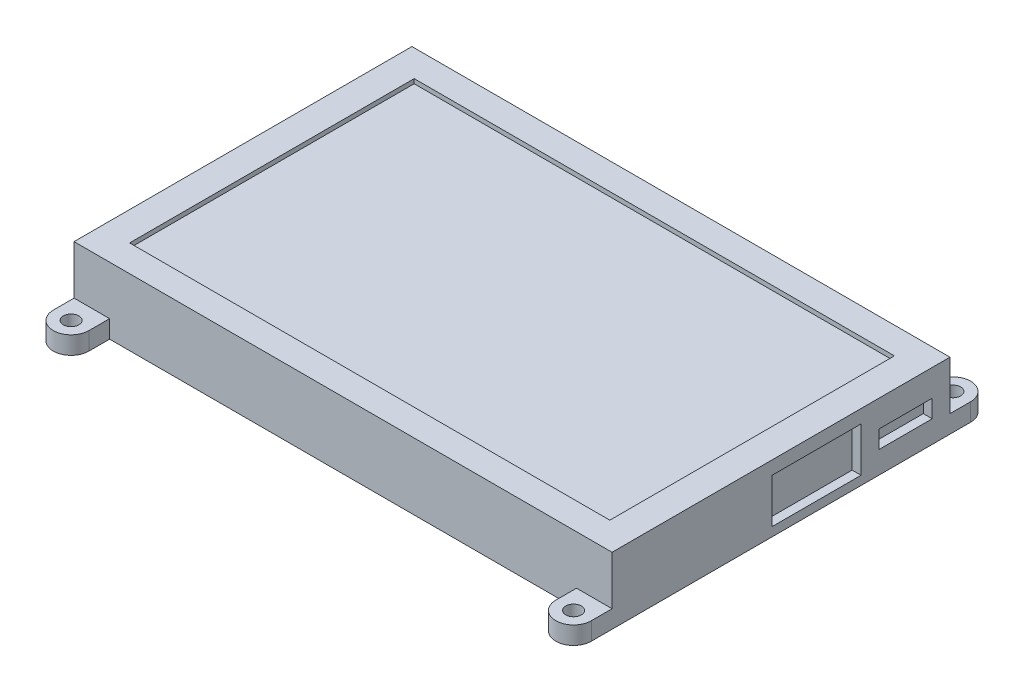
ISO-10303-21;
HEADER;
FILE_DESCRIPTION(('STEP AP214'),'2;1');
FILE_NAME('part.step','',(''),(''),'','','');
FILE_SCHEMA(('AUTOMOTIVE_DESIGN { 1 0 10303 214 1 1 1 1 }'));
ENDSEC;
DATA;
#1=APPLICATION_CONTEXT('core data for automotive mechanical design processes');
#2=APPLICATION_PROTOCOL_DEFINITION('international standard','automotive_design',2000,#1);
#3=PRODUCT_CONTEXT('',#1,'mechanical');
#4=PRODUCT('Part','Part','',(#3));
#5=PRODUCT_RELATED_PRODUCT_CATEGORY('part','',(#4));
#6=PRODUCT_DEFINITION_FORMATION('','',#4);
#7=PRODUCT_DEFINITION_CONTEXT('part definition',#1,'design');
#8=PRODUCT_DEFINITION('design','',#6,#7);
#9=PRODUCT_DEFINITION_SHAPE('','',#8);
#10=(LENGTH_UNIT() NAMED_UNIT(*) SI_UNIT(.MILLI.,.METRE.));
#11=(NAMED_UNIT(*) PLANE_ANGLE_UNIT() SI_UNIT($,.RADIAN.));
#12=(NAMED_UNIT(*) SI_UNIT($,.STERADIAN.) SOLID_ANGLE_UNIT());
#13=UNCERTAINTY_MEASURE_WITH_UNIT(LENGTH_MEASURE(1.E-05),#10,'distance_accuracy_value','');
#14=(GEOMETRIC_REPRESENTATION_CONTEXT(3) GLOBAL_UNCERTAINTY_ASSIGNED_CONTEXT((#13)) GLOBAL_UNIT_ASSIGNED_CONTEXT((#10,
#11,#12)) REPRESENTATION_CONTEXT('',''));
#15=CARTESIAN_POINT('',(0.,0.,0.));
#16=DIRECTION('',(0.,0.,1.));
#17=DIRECTION('',(1.,0.,0.));
#18=AXIS2_PLACEMENT_3D('',#15,#16,#17);
#19=CARTESIAN_POINT('',(0.,0.,0.));
#20=DIRECTION('',(0.,-1.,0.));
#21=DIRECTION('',(0.,0.,-1.));
#22=AXIS2_PLACEMENT_3D('',#19,#20,#21);
#23=PLANE('',#22);
#24=CARTESIAN_POINT('',(117.,0.,4.66000000000001));
#25=DIRECTION('',(0.,-1.,0.));
#26=DIRECTION('',(0.,0.,-1.));
#27=AXIS2_PLACEMENT_3D('',#24,#25,#26);
#28=CIRCLE('',#27,1.75);
#29=CARTESIAN_POINT('',(117.,0.,2.91000000000001));
#30=VERTEX_POINT('',#29);
#31=EDGE_CURVE('E286',#30,#30,#28,.T.);
#32=ORIENTED_EDGE('',*,*,#31,.F.);
#33=EDGE_LOOP('',(#32));
#34=FACE_BOUND('',#33,.T.);
#35=CARTESIAN_POINT('',(117.,0.,-80.65));
#36=DIRECTION('',(0.,-1.,0.));
#37=DIRECTION('',(0.,0.,1.));
#38=AXIS2_PLACEMENT_3D('',#35,#36,#37);
#39=CIRCLE('',#38,4.);
#40=CARTESIAN_POINT('',(113.,0.,-80.65));
#41=VERTEX_POINT('',#40);
#42=CARTESIAN_POINT('',(121.,0.,-80.65));
#43=VERTEX_POINT('',#42);
#44=EDGE_CURVE('E355',#41,#43,#39,.T.);
#45=ORIENTED_EDGE('',*,*,#44,.T.);
#46=DIRECTION('',(0.,0.,-1.));
#47=VECTOR('',#46,1.);
#48=CARTESIAN_POINT('',(121.,0.,0.));
#49=LINE('',#48,#47);
#50=CARTESIAN_POINT('',(121.,0.,4.66000000000001));
#51=VERTEX_POINT('',#50);
#52=EDGE_CURVE('E446',#51,#43,#49,.T.);
#53=ORIENTED_EDGE('',*,*,#52,.F.);
#54=CARTESIAN_POINT('',(117.,0.,4.66000000000001));
#55=DIRECTION('',(0.,-1.,0.));
#56=DIRECTION('',(0.,0.,-1.));
#57=AXIS2_PLACEMENT_3D('',#54,#55,#56);
#58=CIRCLE('',#57,4.);
#59=CARTESIAN_POINT('',(113.,0.,4.66000000000001));
#60=VERTEX_POINT('',#59);
#61=EDGE_CURVE('E307',#51,#60,#58,.T.);
#62=ORIENTED_EDGE('',*,*,#61,.T.);
#63=DIRECTION('',(0.,0.,-1.));
#64=VECTOR('',#63,1.);
#65=CARTESIAN_POINT('',(113.,0.,4.66000000000001));
#66=LINE('',#65,#64);
#67=CARTESIAN_POINT('',(113.,0.,0.));
#68=VERTEX_POINT('',#67);
#69=EDGE_CURVE('E314',#60,#68,#66,.T.);
#70=ORIENTED_EDGE('',*,*,#69,.T.);
#71=DIRECTION('',(1.,0.,0.));
#72=VECTOR('',#71,1.);
#73=CARTESIAN_POINT('',(0.,0.,0.));
#74=LINE('',#73,#72);
#75=CARTESIAN_POINT('',(8.,0.,0.));
#76=VERTEX_POINT('',#75);
#77=EDGE_CURVE('E434',#76,#68,#74,.T.);
#78=ORIENTED_EDGE('',*,*,#77,.F.);
#79=DIRECTION('',(0.,0.,1.));
#80=VECTOR('',#79,1.);
#81=CARTESIAN_POINT('',(8.,0.,4.66));
#82=LINE('',#81,#80);
#83=CARTESIAN_POINT('',(8.,0.,4.66));
#84=VERTEX_POINT('',#83);
#85=EDGE_CURVE('E338',#76,#84,#82,.T.);
#86=ORIENTED_EDGE('',*,*,#85,.T.);
#87=CARTESIAN_POINT('',(4.,0.,4.66));
#88=DIRECTION('',(0.,-1.,0.));
#89=DIRECTION('',(0.,0.,1.));
#90=AXIS2_PLACEMENT_3D('',#87,#88,#89);
#91=CIRCLE('',#90,4.);
#92=CARTESIAN_POINT('',(0.,0.,4.66));
#93=VERTEX_POINT('',#92);
#94=EDGE_CURVE('E333',#84,#93,#91,.T.);
#95=ORIENTED_EDGE('',*,*,#94,.T.);
#96=DIRECTION('',(0.,0.,-1.));
#97=VECTOR('',#96,1.);
#98=CARTESIAN_POINT('',(0.,0.,0.));
#99=LINE('',#98,#97);
#100=CARTESIAN_POINT('',(0.,0.,-80.65));
#101=VERTEX_POINT('',#100);
#102=EDGE_CURVE('E423',#93,#101,#99,.T.);
#103=ORIENTED_EDGE('',*,*,#102,.T.);
#104=CARTESIAN_POINT('',(4.,0.,-80.65));
#105=DIRECTION('',(0.,-1.,0.));
#106=DIRECTION('',(0.,0.,-1.));
#107=AXIS2_PLACEMENT_3D('',#104,#105,#106);
#108=CIRCLE('',#107,4.);
#109=CARTESIAN_POINT('',(8.,0.,-80.65));
#110=VERTEX_POINT('',#109);
#111=EDGE_CURVE('E376',#101,#110,#108,.T.);
#112=ORIENTED_EDGE('',*,*,#111,.T.);
#113=DIRECTION('',(0.,0.,1.));
#114=VECTOR('',#113,1.);
#115=CARTESIAN_POINT('',(8.,0.,-80.65));
#116=LINE('',#115,#114);
#117=CARTESIAN_POINT('',(8.,0.,-75.99));
#118=VERTEX_POINT('',#117);
#119=EDGE_CURVE('E381',#110,#118,#116,.T.);
#120=ORIENTED_EDGE('',*,*,#119,.T.);
#121=DIRECTION('',(1.,0.,0.));
#122=VECTOR('',#121,1.);
#123=CARTESIAN_POINT('',(0.,0.,-75.99));
#124=LINE('',#123,#122);
#125=CARTESIAN_POINT('',(113.,0.,-75.99));
#126=VERTEX_POINT('',#125);
#127=EDGE_CURVE('E443',#118,#126,#124,.T.);
#128=ORIENTED_EDGE('',*,*,#127,.T.);
#129=DIRECTION('',(0.,0.,-1.));
#130=VECTOR('',#129,1.);
#131=CARTESIAN_POINT('',(113.,0.,-80.65));
#132=LINE('',#131,#130);
#133=EDGE_CURVE('E360',#126,#41,#132,.T.);
#134=ORIENTED_EDGE('',*,*,#133,.T.);
#135=EDGE_LOOP('',(#45,#53,#62,#70,#78,#86,#95,#103,#112,#120,#128,#134));
#136=FACE_BOUND('',#135,.T.);
#137=CARTESIAN_POINT('',(117.,0.,-80.65));
#138=DIRECTION('',(0.,1.,0.));
#139=DIRECTION('',(0.,0.,1.));
#140=AXIS2_PLACEMENT_3D('',#137,#138,#139);
#141=CIRCLE('',#140,1.75);
#142=CARTESIAN_POINT('',(117.,0.,-78.9));
#143=VERTEX_POINT('',#142);
#144=EDGE_CURVE('E289',#143,#143,#141,.T.);
#145=ORIENTED_EDGE('',*,*,#144,.T.);
#146=EDGE_LOOP('',(#145));
#147=FACE_BOUND('',#146,.T.);
#148=CARTESIAN_POINT('',(4.,0.,-80.65));
#149=DIRECTION('',(0.,-1.,0.));
#150=DIRECTION('',(0.,0.,-1.));
#151=AXIS2_PLACEMENT_3D('',#148,#149,#150);
#152=CIRCLE('',#151,1.75);
#153=CARTESIAN_POINT('',(4.,0.,-82.4));
#154=VERTEX_POINT('',#153);
#155=EDGE_CURVE('E299',#154,#154,#152,.T.);
#156=ORIENTED_EDGE('',*,*,#155,.F.);
#157=EDGE_LOOP('',(#156));
#158=FACE_BOUND('',#157,.T.);
#159=CARTESIAN_POINT('',(4.,0.,4.66));
#160=DIRECTION('',(0.,1.,0.));
#161=DIRECTION('',(0.,0.,1.));
#162=AXIS2_PLACEMENT_3D('',#159,#160,#161);
#163=CIRCLE('',#162,1.75);
#164=CARTESIAN_POINT('',(4.,0.,6.41));
#165=VERTEX_POINT('',#164);
#166=EDGE_CURVE('E293',#165,#165,#163,.T.);
#167=ORIENTED_EDGE('',*,*,#166,.T.);
#168=EDGE_LOOP('',(#167));
#169=FACE_BOUND('',#168,.T.);
#170=ADVANCED_FACE('F33',(#34,#136,#147,#158,#169),#23,.T.);
#171=CARTESIAN_POINT('',(0.,15.,0.));
#172=DIRECTION('',(-1.,0.,0.));
#173=DIRECTION('',(0.,0.,1.));
#174=AXIS2_PLACEMENT_3D('',#171,#172,#173);
#175=PLANE('',#174);
#176=DIRECTION('',(0.,-1.,0.));
#177=VECTOR('',#176,1.);
#178=CARTESIAN_POINT('',(0.,4.,-80.65));
#179=LINE('',#178,#177);
#180=CARTESIAN_POINT('',(0.,4.,-80.65));
#181=VERTEX_POINT('',#180);
#182=EDGE_CURVE('E390',#181,#101,#179,.T.);
#183=ORIENTED_EDGE('',*,*,#182,.T.);
#184=ORIENTED_EDGE('',*,*,#102,.F.);
#185=DIRECTION('',(0.,-1.,0.));
#186=VECTOR('',#185,1.);
#187=CARTESIAN_POINT('',(0.,4.,4.66));
#188=LINE('',#187,#186);
#189=CARTESIAN_POINT('',(0.,4.,4.66));
#190=VERTEX_POINT('',#189);
#191=EDGE_CURVE('E343',#190,#93,#188,.T.);
#192=ORIENTED_EDGE('',*,*,#191,.F.);
#193=DIRECTION('',(0.,0.,-1.));
#194=VECTOR('',#193,1.);
#195=CARTESIAN_POINT('',(0.,4.,4.66));
#196=LINE('',#195,#194);
#197=CARTESIAN_POINT('',(0.,4.,0.));
#198=VERTEX_POINT('',#197);
#199=EDGE_CURVE('E337',#190,#198,#196,.T.);
#200=ORIENTED_EDGE('',*,*,#199,.T.);
#201=DIRECTION('',(0.,-1.,0.));
#202=VECTOR('',#201,1.);
#203=CARTESIAN_POINT('',(0.,15.,0.));
#204=LINE('',#203,#202);
#205=CARTESIAN_POINT('',(0.,15.,0.));
#206=VERTEX_POINT('',#205);
#207=EDGE_CURVE('E449',#206,#198,#204,.T.);
#208=ORIENTED_EDGE('',*,*,#207,.F.);
#209=DIRECTION('',(0.,0.,-1.));
#210=VECTOR('',#209,1.);
#211=CARTESIAN_POINT('',(0.,15.,0.));
#212=LINE('',#211,#210);
#213=CARTESIAN_POINT('',(0.,15.,-75.99));
#214=VERTEX_POINT('',#213);
#215=EDGE_CURVE('E430',#206,#214,#212,.T.);
#216=ORIENTED_EDGE('',*,*,#215,.T.);
#217=DIRECTION('',(0.,-1.,0.));
#218=VECTOR('',#217,1.);
#219=CARTESIAN_POINT('',(0.,15.,-75.99));
#220=LINE('',#219,#218);
#221=CARTESIAN_POINT('',(0.,4.,-75.99));
#222=VERTEX_POINT('',#221);
#223=EDGE_CURVE('E441',#214,#222,#220,.T.);
#224=ORIENTED_EDGE('',*,*,#223,.T.);
#225=DIRECTION('',(0.,0.,-1.));
#226=VECTOR('',#225,1.);
#227=CARTESIAN_POINT('',(0.,4.,-80.65));
#228=LINE('',#227,#226);
#229=EDGE_CURVE('E384',#222,#181,#228,.T.);
#230=ORIENTED_EDGE('',*,*,#229,.T.);
#231=EDGE_LOOP('',(#183,#184,#192,#200,#208,#216,#224,#230));
#232=FACE_BOUND('',#231,.T.);
#233=ADVANCED_FACE('F35',(#232),#175,.T.);
#234=CARTESIAN_POINT('',(0.,15.,0.));
#235=DIRECTION('',(0.,0.,-1.));
#236=DIRECTION('',(-1.,0.,0.));
#237=AXIS2_PLACEMENT_3D('',#234,#235,#236);
#238=PLANE('',#237);
#239=ORIENTED_EDGE('',*,*,#77,.T.);
#240=DIRECTION('',(0.,1.,0.));
#241=VECTOR('',#240,1.);
#242=CARTESIAN_POINT('',(113.,15.,0.));
#243=LINE('',#242,#241);
#244=CARTESIAN_POINT('',(113.,4.,0.));
#245=VERTEX_POINT('',#244);
#246=EDGE_CURVE('E327',#68,#245,#243,.T.);
#247=ORIENTED_EDGE('',*,*,#246,.T.);
#248=DIRECTION('',(-1.,0.,0.));
#249=VECTOR('',#248,1.);
#250=CARTESIAN_POINT('',(0.,4.,0.));
#251=LINE('',#250,#249);
#252=CARTESIAN_POINT('',(121.,4.,0.));
#253=VERTEX_POINT('',#252);
#254=EDGE_CURVE('E330',#253,#245,#251,.T.);
#255=ORIENTED_EDGE('',*,*,#254,.F.);
#256=DIRECTION('',(0.,-1.,0.));
#257=VECTOR('',#256,1.);
#258=CARTESIAN_POINT('',(121.,15.,0.));
#259=LINE('',#258,#257);
#260=CARTESIAN_POINT('',(121.,15.,0.));
#261=VERTEX_POINT('',#260);
#262=EDGE_CURVE('E452',#261,#253,#259,.T.);
#263=ORIENTED_EDGE('',*,*,#262,.F.);
#264=DIRECTION('',(1.,0.,0.));
#265=VECTOR('',#264,1.);
#266=CARTESIAN_POINT('',(0.,15.,0.));
#267=LINE('',#266,#265);
#268=EDGE_CURVE('E439',#206,#261,#267,.T.);
#269=ORIENTED_EDGE('',*,*,#268,.F.);
#270=ORIENTED_EDGE('',*,*,#207,.T.);
#271=DIRECTION('',(1.,0.,0.));
#272=VECTOR('',#271,1.);
#273=CARTESIAN_POINT('',(0.,4.,0.));
#274=LINE('',#273,#272);
#275=CARTESIAN_POINT('',(8.,4.,0.));
#276=VERTEX_POINT('',#275);
#277=EDGE_CURVE('E11',#198,#276,#274,.T.);
#278=ORIENTED_EDGE('',*,*,#277,.T.);
#279=DIRECTION('',(0.,-1.,0.));
#280=VECTOR('',#279,1.);
#281=CARTESIAN_POINT('',(8.,15.,0.));
#282=LINE('',#281,#280);
#283=EDGE_CURVE('E350',#276,#76,#282,.T.);
#284=ORIENTED_EDGE('',*,*,#283,.T.);
#285=EDGE_LOOP('',(#239,#247,#255,#263,#269,#270,#278,#284));
#286=FACE_BOUND('',#285,.T.);
#287=ADVANCED_FACE('F484',(#286),#238,.F.);
#288=CARTESIAN_POINT('',(121.,15.,0.));
#289=DIRECTION('',(-1.,0.,0.));
#290=DIRECTION('',(0.,0.,1.));
#291=AXIS2_PLACEMENT_3D('',#288,#289,#290);
#292=PLANE('',#291);
#293=DIRECTION('',(0.,0.,-1.));
#294=VECTOR('',#293,1.);
#295=CARTESIAN_POINT('',(121.,2.,-55.99));
#296=LINE('',#295,#294);
#297=CARTESIAN_POINT('',(121.,2.,-35.99));
#298=VERTEX_POINT('',#297);
#299=CARTESIAN_POINT('',(121.,2.,-55.99));
#300=VERTEX_POINT('',#299);
#301=EDGE_CURVE('E246',#298,#300,#296,.T.);
#302=ORIENTED_EDGE('',*,*,#301,.F.);
#303=DIRECTION('',(0.,-1.,0.));
#304=VECTOR('',#303,1.);
#305=CARTESIAN_POINT('',(121.,12.,-35.99));
#306=LINE('',#305,#304);
#307=CARTESIAN_POINT('',(121.,12.,-35.99));
#308=VERTEX_POINT('',#307);
#309=EDGE_CURVE('E48',#308,#298,#306,.T.);
#310=ORIENTED_EDGE('',*,*,#309,.F.);
#311=DIRECTION('',(0.,0.,1.));
#312=VECTOR('',#311,1.);
#313=CARTESIAN_POINT('',(121.,12.,-55.99));
#314=LINE('',#313,#312);
#315=CARTESIAN_POINT('',(121.,12.,-55.99));
#316=VERTEX_POINT('',#315);
#317=EDGE_CURVE('E237',#316,#308,#314,.T.);
#318=ORIENTED_EDGE('',*,*,#317,.F.);
#319=DIRECTION('',(0.,1.,0.));
#320=VECTOR('',#319,1.);
#321=CARTESIAN_POINT('',(121.,12.,-55.99));
#322=LINE('',#321,#320);
#323=EDGE_CURVE('E240',#300,#316,#322,.T.);
#324=ORIENTED_EDGE('',*,*,#323,.F.);
#325=EDGE_LOOP('',(#302,#310,#318,#324));
#326=FACE_BOUND('',#325,.T.);
#327=DIRECTION('',(0.,0.,-1.));
#328=VECTOR('',#327,1.);
#329=CARTESIAN_POINT('',(121.,5.,-71.99));
#330=LINE('',#329,#328);
#331=CARTESIAN_POINT('',(121.,5.,-59.99));
#332=VERTEX_POINT('',#331);
#333=CARTESIAN_POINT('',(121.,5.,-71.99));
#334=VERTEX_POINT('',#333);
#335=EDGE_CURVE('E270',#332,#334,#330,.T.);
#336=ORIENTED_EDGE('',*,*,#335,.F.);
#337=DIRECTION('',(0.,-1.,0.));
#338=VECTOR('',#337,1.);
#339=CARTESIAN_POINT('',(121.,9.,-59.99));
#340=LINE('',#339,#338);
#341=CARTESIAN_POINT('',(121.,9.,-59.99));
#342=VERTEX_POINT('',#341);
#343=EDGE_CURVE('E56',#342,#332,#340,.T.);
#344=ORIENTED_EDGE('',*,*,#343,.F.);
#345=DIRECTION('',(0.,0.,1.));
#346=VECTOR('',#345,1.);
#347=CARTESIAN_POINT('',(121.,9.,-71.99));
#348=LINE('',#347,#346);
#349=CARTESIAN_POINT('',(121.,9.,-71.99));
#350=VERTEX_POINT('',#349);
#351=EDGE_CURVE('E259',#350,#342,#348,.T.);
#352=ORIENTED_EDGE('',*,*,#351,.F.);
#353=DIRECTION('',(0.,1.,0.));
#354=VECTOR('',#353,1.);
#355=CARTESIAN_POINT('',(121.,9.,-71.99));
#356=LINE('',#355,#354);
#357=EDGE_CURVE('E273',#334,#350,#356,.T.);
#358=ORIENTED_EDGE('',*,*,#357,.F.);
#359=EDGE_LOOP('',(#336,#344,#352,#358));
#360=FACE_BOUND('',#359,.T.);
#361=ORIENTED_EDGE('',*,*,#52,.T.);
#362=DIRECTION('',(0.,-1.,0.));
#363=VECTOR('',#362,1.);
#364=CARTESIAN_POINT('',(121.,4.,-80.65));
#365=LINE('',#364,#363);
#366=CARTESIAN_POINT('',(121.,4.,-80.65));
#367=VERTEX_POINT('',#366);
#368=EDGE_CURVE('E365',#367,#43,#365,.T.);
#369=ORIENTED_EDGE('',*,*,#368,.F.);
#370=DIRECTION('',(0.,0.,1.));
#371=VECTOR('',#370,1.);
#372=CARTESIAN_POINT('',(121.,4.,-80.65));
#373=LINE('',#372,#371);
#374=CARTESIAN_POINT('',(121.,4.,-75.99));
#375=VERTEX_POINT('',#374);
#376=EDGE_CURVE('E359',#367,#375,#373,.T.);
#377=ORIENTED_EDGE('',*,*,#376,.T.);
#378=DIRECTION('',(0.,-1.,0.));
#379=VECTOR('',#378,1.);
#380=CARTESIAN_POINT('',(121.,15.,-75.99));
#381=LINE('',#380,#379);
#382=CARTESIAN_POINT('',(121.,15.,-75.99));
#383=VERTEX_POINT('',#382);
#384=EDGE_CURVE('E455',#383,#375,#381,.T.);
#385=ORIENTED_EDGE('',*,*,#384,.F.);
#386=DIRECTION('',(0.,0.,-1.));
#387=VECTOR('',#386,1.);
#388=CARTESIAN_POINT('',(121.,15.,0.));
#389=LINE('',#388,#387);
#390=EDGE_CURVE('E437',#261,#383,#389,.T.);
#391=ORIENTED_EDGE('',*,*,#390,.F.);
#392=ORIENTED_EDGE('',*,*,#262,.T.);
#393=DIRECTION('',(0.,0.,1.));
#394=VECTOR('',#393,1.);
#395=CARTESIAN_POINT('',(121.,4.,4.66000000000001));
#396=LINE('',#395,#394);
#397=CARTESIAN_POINT('',(121.,4.,4.66000000000001));
#398=VERTEX_POINT('',#397);
#399=EDGE_CURVE('E317',#253,#398,#396,.T.);
#400=ORIENTED_EDGE('',*,*,#399,.T.);
#401=DIRECTION('',(0.,-1.,0.));
#402=VECTOR('',#401,1.);
#403=CARTESIAN_POINT('',(121.,4.,4.66000000000001));
#404=LINE('',#403,#402);
#405=EDGE_CURVE('E324',#398,#51,#404,.T.);
#406=ORIENTED_EDGE('',*,*,#405,.T.);
#407=EDGE_LOOP('',(#361,#369,#377,#385,#391,#392,#400,#406));
#408=FACE_BOUND('',#407,.T.);
#409=ADVANCED_FACE('F471',(#326,#360,#408),#292,.F.);
#410=CARTESIAN_POINT('',(0.,15.,-75.99));
#411=DIRECTION('',(0.,0.,-1.));
#412=DIRECTION('',(-1.,0.,0.));
#413=AXIS2_PLACEMENT_3D('',#410,#411,#412);
#414=PLANE('',#413);
#415=DIRECTION('',(0.,1.,0.));
#416=VECTOR('',#415,1.);
#417=CARTESIAN_POINT('',(113.,15.,-75.99));
#418=LINE('',#417,#416);
#419=CARTESIAN_POINT('',(113.,4.,-75.99));
#420=VERTEX_POINT('',#419);
#421=EDGE_CURVE('E372',#126,#420,#418,.T.);
#422=ORIENTED_EDGE('',*,*,#421,.F.);
#423=ORIENTED_EDGE('',*,*,#127,.F.);
#424=DIRECTION('',(0.,-1.,0.));
#425=VECTOR('',#424,1.);
#426=CARTESIAN_POINT('',(8.,15.,-75.99));
#427=LINE('',#426,#425);
#428=CARTESIAN_POINT('',(8.,4.,-75.99));
#429=VERTEX_POINT('',#428);
#430=EDGE_CURVE('E393',#429,#118,#427,.T.);
#431=ORIENTED_EDGE('',*,*,#430,.F.);
#432=DIRECTION('',(-1.,0.,0.));
#433=VECTOR('',#432,1.);
#434=CARTESIAN_POINT('',(0.,4.,-75.99));
#435=LINE('',#434,#433);
#436=EDGE_CURVE('E451',#429,#222,#435,.T.);
#437=ORIENTED_EDGE('',*,*,#436,.T.);
#438=ORIENTED_EDGE('',*,*,#223,.F.);
#439=DIRECTION('',(1.,0.,0.));
#440=VECTOR('',#439,1.);
#441=CARTESIAN_POINT('',(0.,15.,-75.99));
#442=LINE('',#441,#440);
#443=EDGE_CURVE('E433',#214,#383,#442,.T.);
#444=ORIENTED_EDGE('',*,*,#443,.T.);
#445=ORIENTED_EDGE('',*,*,#384,.T.);
#446=DIRECTION('',(1.,0.,0.));
#447=VECTOR('',#446,1.);
#448=CARTESIAN_POINT('',(0.,4.,-75.99));
#449=LINE('',#448,#447);
#450=EDGE_CURVE('E41',#420,#375,#449,.T.);
#451=ORIENTED_EDGE('',*,*,#450,.F.);
#452=EDGE_LOOP('',(#422,#423,#431,#437,#438,#444,#445,#451));
#453=FACE_BOUND('',#452,.T.);
#454=ADVANCED_FACE('F473',(#453),#414,.T.);
#455=CARTESIAN_POINT('',(0.,15.,0.));
#456=DIRECTION('',(0.,-1.,0.));
#457=DIRECTION('',(0.,0.,-1.));
#458=AXIS2_PLACEMENT_3D('',#455,#456,#457);
#459=PLANE('',#458);
#460=DIRECTION('',(-1.,0.,0.));
#461=VECTOR('',#460,1.);
#462=CARTESIAN_POINT('',(6.49999999999998,15.,-69.995));
#463=LINE('',#462,#461);
#464=CARTESIAN_POINT('',(114.5,15.,-69.995));
#465=VERTEX_POINT('',#464);
#466=CARTESIAN_POINT('',(6.49999999999998,15.,-69.995));
#467=VERTEX_POINT('',#466);
#468=EDGE_CURVE('E413',#465,#467,#463,.T.);
#469=ORIENTED_EDGE('',*,*,#468,.F.);
#470=DIRECTION('',(0.,0.,-1.));
#471=VECTOR('',#470,1.);
#472=CARTESIAN_POINT('',(114.5,15.,-69.995));
#473=LINE('',#472,#471);
#474=CARTESIAN_POINT('',(114.5,15.,-5.99500000000002));
#475=VERTEX_POINT('',#474);
#476=EDGE_CURVE('E397',#475,#465,#473,.T.);
#477=ORIENTED_EDGE('',*,*,#476,.F.);
#478=DIRECTION('',(1.,0.,0.));
#479=VECTOR('',#478,1.);
#480=CARTESIAN_POINT('',(6.49999999999999,15.,-5.99500000000002));
#481=LINE('',#480,#479);
#482=CARTESIAN_POINT('',(6.49999999999999,15.,-5.99500000000002));
#483=VERTEX_POINT('',#482);
#484=EDGE_CURVE('E402',#483,#475,#481,.T.);
#485=ORIENTED_EDGE('',*,*,#484,.F.);
#486=DIRECTION('',(0.,0.,1.));
#487=VECTOR('',#486,1.);
#488=CARTESIAN_POINT('',(6.49999999999998,15.,-69.995));
#489=LINE('',#488,#487);
#490=EDGE_CURVE('E416',#467,#483,#489,.T.);
#491=ORIENTED_EDGE('',*,*,#490,.F.);
#492=EDGE_LOOP('',(#469,#477,#485,#491));
#493=FACE_BOUND('',#492,.T.);
#494=ORIENTED_EDGE('',*,*,#215,.F.);
#495=ORIENTED_EDGE('',*,*,#268,.T.);
#496=ORIENTED_EDGE('',*,*,#390,.T.);
#497=ORIENTED_EDGE('',*,*,#443,.F.);
#498=EDGE_LOOP('',(#494,#495,#496,#497));
#499=FACE_BOUND('',#498,.T.);
#500=ADVANCED_FACE('F477',(#493,#499),#459,.F.);
#501=CARTESIAN_POINT('',(114.5,14.,-69.995));
#502=DIRECTION('',(1.,0.,0.));
#503=DIRECTION('',(0.,0.,-1.));
#504=AXIS2_PLACEMENT_3D('',#501,#502,#503);
#505=PLANE('',#504);
#506=ORIENTED_EDGE('',*,*,#476,.T.);
#507=DIRECTION('',(0.,1.,0.));
#508=VECTOR('',#507,1.);
#509=CARTESIAN_POINT('',(114.5,14.,-69.995));
#510=LINE('',#509,#508);
#511=CARTESIAN_POINT('',(114.5,14.,-69.995));
#512=VERTEX_POINT('',#511);
#513=EDGE_CURVE('E411',#512,#465,#510,.T.);
#514=ORIENTED_EDGE('',*,*,#513,.F.);
#515=DIRECTION('',(0.,0.,-1.));
#516=VECTOR('',#515,1.);
#517=CARTESIAN_POINT('',(114.5,14.,-69.995));
#518=LINE('',#517,#516);
#519=CARTESIAN_POINT('',(114.5,14.,-5.99500000000002));
#520=VERTEX_POINT('',#519);
#521=EDGE_CURVE('E398',#520,#512,#518,.T.);
#522=ORIENTED_EDGE('',*,*,#521,.F.);
#523=DIRECTION('',(0.,1.,0.));
#524=VECTOR('',#523,1.);
#525=CARTESIAN_POINT('',(114.5,14.,-5.99500000000002));
#526=LINE('',#525,#524);
#527=EDGE_CURVE('E421',#520,#475,#526,.T.);
#528=ORIENTED_EDGE('',*,*,#527,.T.);
#529=EDGE_LOOP('',(#506,#514,#522,#528));
#530=FACE_BOUND('',#529,.T.);
#531=ADVANCED_FACE('F559',(#530),#505,.F.);
#532=CARTESIAN_POINT('',(6.49999999999999,14.,-5.99500000000002));
#533=DIRECTION('',(0.,0.,1.));
#534=DIRECTION('',(1.,0.,0.));
#535=AXIS2_PLACEMENT_3D('',#532,#533,#534);
#536=PLANE('',#535);
#537=ORIENTED_EDGE('',*,*,#484,.T.);
#538=ORIENTED_EDGE('',*,*,#527,.F.);
#539=DIRECTION('',(1.,0.,0.));
#540=VECTOR('',#539,1.);
#541=CARTESIAN_POINT('',(6.49999999999999,14.,-5.99500000000002));
#542=LINE('',#541,#540);
#543=CARTESIAN_POINT('',(6.49999999999999,14.,-5.99500000000002));
#544=VERTEX_POINT('',#543);
#545=EDGE_CURVE('E408',#544,#520,#542,.T.);
#546=ORIENTED_EDGE('',*,*,#545,.F.);
#547=DIRECTION('',(0.,1.,0.));
#548=VECTOR('',#547,1.);
#549=CARTESIAN_POINT('',(6.49999999999999,14.,-5.99500000000002));
#550=LINE('',#549,#548);
#551=EDGE_CURVE('E424',#544,#483,#550,.T.);
#552=ORIENTED_EDGE('',*,*,#551,.T.);
#553=EDGE_LOOP('',(#537,#538,#546,#552));
#554=FACE_BOUND('',#553,.T.);
#555=ADVANCED_FACE('F564',(#554),#536,.F.);
#556=CARTESIAN_POINT('',(6.49999999999998,14.,-69.995));
#557=DIRECTION('',(-1.,0.,0.));
#558=DIRECTION('',(0.,0.,1.));
#559=AXIS2_PLACEMENT_3D('',#556,#557,#558);
#560=PLANE('',#559);
#561=ORIENTED_EDGE('',*,*,#490,.T.);
#562=ORIENTED_EDGE('',*,*,#551,.F.);
#563=DIRECTION('',(0.,0.,1.));
#564=VECTOR('',#563,1.);
#565=CARTESIAN_POINT('',(6.49999999999998,14.,-69.995));
#566=LINE('',#565,#564);
#567=CARTESIAN_POINT('',(6.49999999999998,14.,-69.995));
#568=VERTEX_POINT('',#567);
#569=EDGE_CURVE('E405',#568,#544,#566,.T.);
#570=ORIENTED_EDGE('',*,*,#569,.F.);
#571=DIRECTION('',(0.,1.,0.));
#572=VECTOR('',#571,1.);
#573=CARTESIAN_POINT('',(6.49999999999998,14.,-69.995));
#574=LINE('',#573,#572);
#575=EDGE_CURVE('E426',#568,#467,#574,.T.);
#576=ORIENTED_EDGE('',*,*,#575,.T.);
#577=EDGE_LOOP('',(#561,#562,#570,#576));
#578=FACE_BOUND('',#577,.T.);
#579=ADVANCED_FACE('F578',(#578),#560,.F.);
#580=CARTESIAN_POINT('',(6.49999999999998,14.,-69.995));
#581=DIRECTION('',(0.,0.,-1.));
#582=DIRECTION('',(-1.,0.,0.));
#583=AXIS2_PLACEMENT_3D('',#580,#581,#582);
#584=PLANE('',#583);
#585=ORIENTED_EDGE('',*,*,#468,.T.);
#586=ORIENTED_EDGE('',*,*,#575,.F.);
#587=DIRECTION('',(-1.,0.,0.));
#588=VECTOR('',#587,1.);
#589=CARTESIAN_POINT('',(6.49999999999998,14.,-69.995));
#590=LINE('',#589,#588);
#591=EDGE_CURVE('E401',#512,#568,#590,.T.);
#592=ORIENTED_EDGE('',*,*,#591,.F.);
#593=ORIENTED_EDGE('',*,*,#513,.T.);
#594=EDGE_LOOP('',(#585,#586,#592,#593));
#595=FACE_BOUND('',#594,.T.);
#596=ADVANCED_FACE('F571',(#595),#584,.F.);
#597=CARTESIAN_POINT('',(0.,14.,0.));
#598=DIRECTION('',(0.,1.,0.));
#599=DIRECTION('',(0.,0.,1.));
#600=AXIS2_PLACEMENT_3D('',#597,#598,#599);
#601=PLANE('',#600);
#602=ORIENTED_EDGE('',*,*,#521,.T.);
#603=ORIENTED_EDGE('',*,*,#591,.T.);
#604=ORIENTED_EDGE('',*,*,#569,.T.);
#605=ORIENTED_EDGE('',*,*,#545,.T.);
#606=EDGE_LOOP('',(#602,#603,#604,#605));
#607=FACE_BOUND('',#606,.T.);
#608=ADVANCED_FACE('F580',(#607),#601,.T.);
#609=CARTESIAN_POINT('',(4.,4.,-80.65));
#610=DIRECTION('',(0.,-1.,0.));
#611=DIRECTION('',(0.,0.,-1.));
#612=AXIS2_PLACEMENT_3D('',#609,#610,#611);
#613=CYLINDRICAL_SURFACE('',#612,4.);
#614=ORIENTED_EDGE('',*,*,#111,.F.);
#615=ORIENTED_EDGE('',*,*,#182,.F.);
#616=CARTESIAN_POINT('',(4.,4.,-80.65));
#617=DIRECTION('',(0.,-1.,0.));
#618=DIRECTION('',(0.,0.,-1.));
#619=AXIS2_PLACEMENT_3D('',#616,#617,#618);
#620=CIRCLE('',#619,4.);
#621=CARTESIAN_POINT('',(8.,4.,-80.65));
#622=VERTEX_POINT('',#621);
#623=EDGE_CURVE('E377',#181,#622,#620,.T.);
#624=ORIENTED_EDGE('',*,*,#623,.T.);
#625=DIRECTION('',(0.,-1.,0.));
#626=VECTOR('',#625,1.);
#627=CARTESIAN_POINT('',(8.,4.,-80.65));
#628=LINE('',#627,#626);
#629=EDGE_CURVE('E386',#622,#110,#628,.T.);
#630=ORIENTED_EDGE('',*,*,#629,.T.);
#631=EDGE_LOOP('',(#614,#615,#624,#630));
#632=FACE_BOUND('',#631,.T.);
#633=ADVANCED_FACE('F515',(#632),#613,.T.);
#634=CARTESIAN_POINT('',(8.,4.,-80.65));
#635=DIRECTION('',(1.,0.,0.));
#636=DIRECTION('',(0.,0.,-1.));
#637=AXIS2_PLACEMENT_3D('',#634,#635,#636);
#638=PLANE('',#637);
#639=DIRECTION('',(0.,0.,1.));
#640=VECTOR('',#639,1.);
#641=CARTESIAN_POINT('',(8.,4.,-80.65));
#642=LINE('',#641,#640);
#643=EDGE_CURVE('E380',#622,#429,#642,.T.);
#644=ORIENTED_EDGE('',*,*,#643,.T.);
#645=ORIENTED_EDGE('',*,*,#430,.T.);
#646=ORIENTED_EDGE('',*,*,#119,.F.);
#647=ORIENTED_EDGE('',*,*,#629,.F.);
#648=EDGE_LOOP('',(#644,#645,#646,#647));
#649=FACE_BOUND('',#648,.T.);
#650=ADVANCED_FACE('F507',(#649),#638,.T.);
#651=CARTESIAN_POINT('',(4.,4.,-80.65));
#652=DIRECTION('',(0.,-1.,0.));
#653=DIRECTION('',(0.,0.,-1.));
#654=AXIS2_PLACEMENT_3D('',#651,#652,#653);
#655=PLANE('',#654);
#656=CARTESIAN_POINT('',(4.,4.,-80.65));
#657=DIRECTION('',(0.,-1.,0.));
#658=DIRECTION('',(0.,0.,-1.));
#659=AXIS2_PLACEMENT_3D('',#656,#657,#658);
#660=CIRCLE('',#659,1.75);
#661=CARTESIAN_POINT('',(4.,4.,-82.4));
#662=VERTEX_POINT('',#661);
#663=EDGE_CURVE('E280',#662,#662,#660,.T.);
#664=ORIENTED_EDGE('',*,*,#663,.T.);
#665=EDGE_LOOP('',(#664));
#666=FACE_BOUND('',#665,.T.);
#667=ORIENTED_EDGE('',*,*,#436,.F.);
#668=ORIENTED_EDGE('',*,*,#643,.F.);
#669=ORIENTED_EDGE('',*,*,#623,.F.);
#670=ORIENTED_EDGE('',*,*,#229,.F.);
#671=EDGE_LOOP('',(#667,#668,#669,#670));
#672=FACE_BOUND('',#671,.T.);
#673=ADVANCED_FACE('F511',(#666,#672),#655,.F.);
#674=CARTESIAN_POINT('',(117.,4.,-80.65));
#675=DIRECTION('',(0.,-1.,0.));
#676=DIRECTION('',(0.,0.,-1.));
#677=AXIS2_PLACEMENT_3D('',#674,#675,#676);
#678=CYLINDRICAL_SURFACE('',#677,4.);
#679=ORIENTED_EDGE('',*,*,#44,.F.);
#680=DIRECTION('',(0.,-1.,0.));
#681=VECTOR('',#680,1.);
#682=CARTESIAN_POINT('',(113.,4.,-80.65));
#683=LINE('',#682,#681);
#684=CARTESIAN_POINT('',(113.,4.,-80.65));
#685=VERTEX_POINT('',#684);
#686=EDGE_CURVE('E369',#685,#41,#683,.T.);
#687=ORIENTED_EDGE('',*,*,#686,.F.);
#688=CARTESIAN_POINT('',(117.,4.,-80.65));
#689=DIRECTION('',(0.,-1.,0.));
#690=DIRECTION('',(0.,0.,1.));
#691=AXIS2_PLACEMENT_3D('',#688,#689,#690);
#692=CIRCLE('',#691,4.);
#693=EDGE_CURVE('E356',#685,#367,#692,.T.);
#694=ORIENTED_EDGE('',*,*,#693,.T.);
#695=ORIENTED_EDGE('',*,*,#368,.T.);
#696=EDGE_LOOP('',(#679,#687,#694,#695));
#697=FACE_BOUND('',#696,.T.);
#698=ADVANCED_FACE('F498',(#697),#678,.T.);
#699=CARTESIAN_POINT('',(113.,4.,-80.65));
#700=DIRECTION('',(-1.,0.,0.));
#701=DIRECTION('',(0.,0.,1.));
#702=AXIS2_PLACEMENT_3D('',#699,#700,#701);
#703=PLANE('',#702);
#704=ORIENTED_EDGE('',*,*,#133,.F.);
#705=ORIENTED_EDGE('',*,*,#421,.T.);
#706=DIRECTION('',(0.,0.,-1.));
#707=VECTOR('',#706,1.);
#708=CARTESIAN_POINT('',(113.,4.,-80.65));
#709=LINE('',#708,#707);
#710=EDGE_CURVE('E363',#420,#685,#709,.T.);
#711=ORIENTED_EDGE('',*,*,#710,.T.);
#712=ORIENTED_EDGE('',*,*,#686,.T.);
#713=EDGE_LOOP('',(#704,#705,#711,#712));
#714=FACE_BOUND('',#713,.T.);
#715=ADVANCED_FACE('F503',(#714),#703,.T.);
#716=CARTESIAN_POINT('',(117.,4.,-80.65));
#717=DIRECTION('',(0.,1.,0.));
#718=DIRECTION('',(0.,0.,1.));
#719=AXIS2_PLACEMENT_3D('',#716,#717,#718);
#720=PLANE('',#719);
#721=CARTESIAN_POINT('',(117.,4.,-80.65));
#722=DIRECTION('',(0.,1.,0.));
#723=DIRECTION('',(0.,0.,1.));
#724=AXIS2_PLACEMENT_3D('',#721,#722,#723);
#725=CIRCLE('',#724,1.75);
#726=CARTESIAN_POINT('',(117.,4.,-78.9));
#727=VERTEX_POINT('',#726);
#728=EDGE_CURVE('E304',#727,#727,#725,.T.);
#729=ORIENTED_EDGE('',*,*,#728,.F.);
#730=EDGE_LOOP('',(#729));
#731=FACE_BOUND('',#730,.T.);
#732=ORIENTED_EDGE('',*,*,#710,.F.);
#733=ORIENTED_EDGE('',*,*,#450,.T.);
#734=ORIENTED_EDGE('',*,*,#376,.F.);
#735=ORIENTED_EDGE('',*,*,#693,.F.);
#736=EDGE_LOOP('',(#732,#733,#734,#735));
#737=FACE_BOUND('',#736,.T.);
#738=ADVANCED_FACE('F465',(#731,#737),#720,.T.);
#739=CARTESIAN_POINT('',(4.,4.,4.66));
#740=DIRECTION('',(0.,1.,0.));
#741=DIRECTION('',(0.,0.,1.));
#742=AXIS2_PLACEMENT_3D('',#739,#740,#741);
#743=PLANE('',#742);
#744=CARTESIAN_POINT('',(4.,4.,4.66));
#745=DIRECTION('',(0.,1.,0.));
#746=DIRECTION('',(0.,0.,1.));
#747=AXIS2_PLACEMENT_3D('',#744,#745,#746);
#748=CIRCLE('',#747,1.75);
#749=CARTESIAN_POINT('',(4.,4.,6.41));
#750=VERTEX_POINT('',#749);
#751=EDGE_CURVE('E296',#750,#750,#748,.T.);
#752=ORIENTED_EDGE('',*,*,#751,.F.);
#753=EDGE_LOOP('',(#752));
#754=FACE_BOUND('',#753,.T.);
#755=ORIENTED_EDGE('',*,*,#277,.F.);
#756=ORIENTED_EDGE('',*,*,#199,.F.);
#757=CARTESIAN_POINT('',(4.,4.,4.66));
#758=DIRECTION('',(0.,-1.,0.));
#759=DIRECTION('',(0.,0.,1.));
#760=AXIS2_PLACEMENT_3D('',#757,#758,#759);
#761=CIRCLE('',#760,4.);
#762=CARTESIAN_POINT('',(8.,4.,4.66));
#763=VERTEX_POINT('',#762);
#764=EDGE_CURVE('E334',#763,#190,#761,.T.);
#765=ORIENTED_EDGE('',*,*,#764,.F.);
#766=DIRECTION('',(0.,0.,1.));
#767=VECTOR('',#766,1.);
#768=CARTESIAN_POINT('',(8.,4.,4.66));
#769=LINE('',#768,#767);
#770=EDGE_CURVE('E341',#276,#763,#769,.T.);
#771=ORIENTED_EDGE('',*,*,#770,.F.);
#772=EDGE_LOOP('',(#755,#756,#765,#771));
#773=FACE_BOUND('',#772,.T.);
#774=ADVANCED_FACE('F527',(#754,#773),#743,.T.);
#775=CARTESIAN_POINT('',(8.,4.,4.66));
#776=DIRECTION('',(1.,0.,0.));
#777=DIRECTION('',(0.,0.,-1.));
#778=AXIS2_PLACEMENT_3D('',#775,#776,#777);
#779=PLANE('',#778);
#780=ORIENTED_EDGE('',*,*,#283,.F.);
#781=ORIENTED_EDGE('',*,*,#770,.T.);
#782=DIRECTION('',(0.,-1.,0.));
#783=VECTOR('',#782,1.);
#784=CARTESIAN_POINT('',(8.,4.,4.66));
#785=LINE('',#784,#783);
#786=EDGE_CURVE('E347',#763,#84,#785,.T.);
#787=ORIENTED_EDGE('',*,*,#786,.T.);
#788=ORIENTED_EDGE('',*,*,#85,.F.);
#789=EDGE_LOOP('',(#780,#781,#787,#788));
#790=FACE_BOUND('',#789,.T.);
#791=ADVANCED_FACE('F524',(#790),#779,.T.);
#792=CARTESIAN_POINT('',(4.,4.,4.66));
#793=DIRECTION('',(0.,-1.,0.));
#794=DIRECTION('',(0.,0.,-1.));
#795=AXIS2_PLACEMENT_3D('',#792,#793,#794);
#796=CYLINDRICAL_SURFACE('',#795,4.);
#797=ORIENTED_EDGE('',*,*,#94,.F.);
#798=ORIENTED_EDGE('',*,*,#786,.F.);
#799=ORIENTED_EDGE('',*,*,#764,.T.);
#800=ORIENTED_EDGE('',*,*,#191,.T.);
#801=EDGE_LOOP('',(#797,#798,#799,#800));
#802=FACE_BOUND('',#801,.T.);
#803=ADVANCED_FACE('F518',(#802),#796,.T.);
#804=CARTESIAN_POINT('',(117.,4.,4.66000000000001));
#805=DIRECTION('',(0.,-1.,0.));
#806=DIRECTION('',(0.,0.,-1.));
#807=AXIS2_PLACEMENT_3D('',#804,#805,#806);
#808=PLANE('',#807);
#809=CARTESIAN_POINT('',(117.,4.,4.66000000000001));
#810=DIRECTION('',(0.,-1.,0.));
#811=DIRECTION('',(0.,0.,-1.));
#812=AXIS2_PLACEMENT_3D('',#809,#810,#811);
#813=CIRCLE('',#812,1.75);
#814=CARTESIAN_POINT('',(117.,4.,2.91000000000001));
#815=VERTEX_POINT('',#814);
#816=EDGE_CURVE('E290',#815,#815,#813,.T.);
#817=ORIENTED_EDGE('',*,*,#816,.T.);
#818=EDGE_LOOP('',(#817));
#819=FACE_BOUND('',#818,.T.);
#820=ORIENTED_EDGE('',*,*,#399,.F.);
#821=ORIENTED_EDGE('',*,*,#254,.T.);
#822=DIRECTION('',(0.,0.,-1.));
#823=VECTOR('',#822,1.);
#824=CARTESIAN_POINT('',(113.,4.,4.66000000000001));
#825=LINE('',#824,#823);
#826=CARTESIAN_POINT('',(113.,4.,4.66000000000001));
#827=VERTEX_POINT('',#826);
#828=EDGE_CURVE('E313',#827,#245,#825,.T.);
#829=ORIENTED_EDGE('',*,*,#828,.F.);
#830=CARTESIAN_POINT('',(117.,4.,4.66000000000001));
#831=DIRECTION('',(0.,-1.,0.));
#832=DIRECTION('',(0.,0.,-1.));
#833=AXIS2_PLACEMENT_3D('',#830,#831,#832);
#834=CIRCLE('',#833,4.);
#835=EDGE_CURVE('E310',#398,#827,#834,.T.);
#836=ORIENTED_EDGE('',*,*,#835,.F.);
#837=EDGE_LOOP('',(#820,#821,#829,#836));
#838=FACE_BOUND('',#837,.T.);
#839=ADVANCED_FACE('F489',(#819,#838),#808,.F.);
#840=CARTESIAN_POINT('',(113.,4.,4.66000000000001));
#841=DIRECTION('',(-1.,0.,0.));
#842=DIRECTION('',(0.,0.,1.));
#843=AXIS2_PLACEMENT_3D('',#840,#841,#842);
#844=PLANE('',#843);
#845=ORIENTED_EDGE('',*,*,#246,.F.);
#846=ORIENTED_EDGE('',*,*,#69,.F.);
#847=DIRECTION('',(0.,-1.,0.));
#848=VECTOR('',#847,1.);
#849=CARTESIAN_POINT('',(113.,4.,4.66000000000001));
#850=LINE('',#849,#848);
#851=EDGE_CURVE('E319',#827,#60,#850,.T.);
#852=ORIENTED_EDGE('',*,*,#851,.F.);
#853=ORIENTED_EDGE('',*,*,#828,.T.);
#854=EDGE_LOOP('',(#845,#846,#852,#853));
#855=FACE_BOUND('',#854,.T.);
#856=ADVANCED_FACE('F530',(#855),#844,.T.);
#857=CARTESIAN_POINT('',(117.,4.,4.66000000000001));
#858=DIRECTION('',(0.,-1.,0.));
#859=DIRECTION('',(0.,0.,-1.));
#860=AXIS2_PLACEMENT_3D('',#857,#858,#859);
#861=CYLINDRICAL_SURFACE('',#860,4.);
#862=ORIENTED_EDGE('',*,*,#61,.F.);
#863=ORIENTED_EDGE('',*,*,#405,.F.);
#864=ORIENTED_EDGE('',*,*,#835,.T.);
#865=ORIENTED_EDGE('',*,*,#851,.T.);
#866=EDGE_LOOP('',(#862,#863,#864,#865));
#867=FACE_BOUND('',#866,.T.);
#868=ADVANCED_FACE('F493',(#867),#861,.T.);
#869=CARTESIAN_POINT('',(117.,4.,-80.65));
#870=DIRECTION('',(0.,-1.,0.));
#871=DIRECTION('',(0.,0.,-1.));
#872=AXIS2_PLACEMENT_3D('',#869,#870,#871);
#873=CYLINDRICAL_SURFACE('',#872,1.75);
#874=ORIENTED_EDGE('',*,*,#728,.T.);
#875=EDGE_LOOP('',(#874));
#876=FACE_BOUND('',#875,.T.);
#877=ORIENTED_EDGE('',*,*,#144,.F.);
#878=EDGE_LOOP('',(#877));
#879=FACE_BOUND('',#878,.T.);
#880=ADVANCED_FACE('F537',(#876,#879),#873,.F.);
#881=CARTESIAN_POINT('',(117.,4.,4.66000000000001));
#882=DIRECTION('',(0.,-1.,0.));
#883=DIRECTION('',(0.,0.,-1.));
#884=AXIS2_PLACEMENT_3D('',#881,#882,#883);
#885=CYLINDRICAL_SURFACE('',#884,1.75);
#886=ORIENTED_EDGE('',*,*,#816,.F.);
#887=EDGE_LOOP('',(#886));
#888=FACE_BOUND('',#887,.T.);
#889=ORIENTED_EDGE('',*,*,#31,.T.);
#890=EDGE_LOOP('',(#889));
#891=FACE_BOUND('',#890,.T.);
#892=ADVANCED_FACE('F731',(#888,#891),#885,.F.);
#893=CARTESIAN_POINT('',(4.,4.,4.66));
#894=DIRECTION('',(0.,-1.,0.));
#895=DIRECTION('',(0.,0.,-1.));
#896=AXIS2_PLACEMENT_3D('',#893,#894,#895);
#897=CYLINDRICAL_SURFACE('',#896,1.75);
#898=ORIENTED_EDGE('',*,*,#751,.T.);
#899=EDGE_LOOP('',(#898));
#900=FACE_BOUND('',#899,.T.);
#901=ORIENTED_EDGE('',*,*,#166,.F.);
#902=EDGE_LOOP('',(#901));
#903=FACE_BOUND('',#902,.T.);
#904=ADVANCED_FACE('F741',(#900,#903),#897,.F.);
#905=CARTESIAN_POINT('',(4.,4.,-80.65));
#906=DIRECTION('',(0.,-1.,0.));
#907=DIRECTION('',(0.,0.,-1.));
#908=AXIS2_PLACEMENT_3D('',#905,#906,#907);
#909=CYLINDRICAL_SURFACE('',#908,1.75);
#910=ORIENTED_EDGE('',*,*,#663,.F.);
#911=EDGE_LOOP('',(#910));
#912=FACE_BOUND('',#911,.T.);
#913=ORIENTED_EDGE('',*,*,#155,.T.);
#914=EDGE_LOOP('',(#913));
#915=FACE_BOUND('',#914,.T.);
#916=ADVANCED_FACE('F751',(#912,#915),#909,.F.);
#917=CARTESIAN_POINT('',(119.,9.,-59.99));
#918=DIRECTION('',(0.,0.,1.));
#919=DIRECTION('',(1.,0.,0.));
#920=AXIS2_PLACEMENT_3D('',#917,#918,#919);
#921=PLANE('',#920);
#922=ORIENTED_EDGE('',*,*,#343,.T.);
#923=DIRECTION('',(1.,0.,0.));
#924=VECTOR('',#923,1.);
#925=CARTESIAN_POINT('',(119.,5.,-59.99));
#926=LINE('',#925,#924);
#927=CARTESIAN_POINT('',(119.,5.,-59.99));
#928=VERTEX_POINT('',#927);
#929=EDGE_CURVE('E268',#928,#332,#926,.T.);
#930=ORIENTED_EDGE('',*,*,#929,.F.);
#931=DIRECTION('',(0.,-1.,0.));
#932=VECTOR('',#931,1.);
#933=CARTESIAN_POINT('',(119.,9.,-59.99));
#934=LINE('',#933,#932);
#935=CARTESIAN_POINT('',(119.,9.,-59.99));
#936=VERTEX_POINT('',#935);
#937=EDGE_CURVE('E255',#936,#928,#934,.T.);
#938=ORIENTED_EDGE('',*,*,#937,.F.);
#939=DIRECTION('',(1.,0.,0.));
#940=VECTOR('',#939,1.);
#941=CARTESIAN_POINT('',(119.,9.,-59.99));
#942=LINE('',#941,#940);
#943=EDGE_CURVE('E278',#936,#342,#942,.T.);
#944=ORIENTED_EDGE('',*,*,#943,.T.);
#945=EDGE_LOOP('',(#922,#930,#938,#944));
#946=FACE_BOUND('',#945,.T.);
#947=ADVANCED_FACE('F761',(#946),#921,.F.);
#948=CARTESIAN_POINT('',(119.,9.,-71.99));
#949=DIRECTION('',(0.,1.,0.));
#950=DIRECTION('',(0.,0.,1.));
#951=AXIS2_PLACEMENT_3D('',#948,#949,#950);
#952=PLANE('',#951);
#953=ORIENTED_EDGE('',*,*,#351,.T.);
#954=ORIENTED_EDGE('',*,*,#943,.F.);
#955=DIRECTION('',(0.,0.,1.));
#956=VECTOR('',#955,1.);
#957=CARTESIAN_POINT('',(119.,9.,-71.99));
#958=LINE('',#957,#956);
#959=CARTESIAN_POINT('',(119.,9.,-71.99));
#960=VERTEX_POINT('',#959);
#961=EDGE_CURVE('E265',#960,#936,#958,.T.);
#962=ORIENTED_EDGE('',*,*,#961,.F.);
#963=DIRECTION('',(1.,0.,0.));
#964=VECTOR('',#963,1.);
#965=CARTESIAN_POINT('',(119.,9.,-71.99));
#966=LINE('',#965,#964);
#967=EDGE_CURVE('E281',#960,#350,#966,.T.);
#968=ORIENTED_EDGE('',*,*,#967,.T.);
#969=EDGE_LOOP('',(#953,#954,#962,#968));
#970=FACE_BOUND('',#969,.T.);
#971=ADVANCED_FACE('F776',(#970),#952,.F.);
#972=CARTESIAN_POINT('',(119.,9.,-71.99));
#973=DIRECTION('',(0.,0.,-1.));
#974=DIRECTION('',(-1.,0.,0.));
#975=AXIS2_PLACEMENT_3D('',#972,#973,#974);
#976=PLANE('',#975);
#977=ORIENTED_EDGE('',*,*,#357,.T.);
#978=ORIENTED_EDGE('',*,*,#967,.F.);
#979=DIRECTION('',(0.,1.,0.));
#980=VECTOR('',#979,1.);
#981=CARTESIAN_POINT('',(119.,9.,-71.99));
#982=LINE('',#981,#980);
#983=CARTESIAN_POINT('',(119.,5.,-71.99));
#984=VERTEX_POINT('',#983);
#985=EDGE_CURVE('E262',#984,#960,#982,.T.);
#986=ORIENTED_EDGE('',*,*,#985,.F.);
#987=DIRECTION('',(1.,0.,0.));
#988=VECTOR('',#987,1.);
#989=CARTESIAN_POINT('',(119.,5.,-71.99));
#990=LINE('',#989,#988);
#991=EDGE_CURVE('E283',#984,#334,#990,.T.);
#992=ORIENTED_EDGE('',*,*,#991,.T.);
#993=EDGE_LOOP('',(#977,#978,#986,#992));
#994=FACE_BOUND('',#993,.T.);
#995=ADVANCED_FACE('F785',(#994),#976,.F.);
#996=CARTESIAN_POINT('',(119.,5.,-71.99));
#997=DIRECTION('',(0.,-1.,0.));
#998=DIRECTION('',(0.,0.,-1.));
#999=AXIS2_PLACEMENT_3D('',#996,#997,#998);
#1000=PLANE('',#999);
#1001=ORIENTED_EDGE('',*,*,#335,.T.);
#1002=ORIENTED_EDGE('',*,*,#991,.F.);
#1003=DIRECTION('',(0.,0.,-1.));
#1004=VECTOR('',#1003,1.);
#1005=CARTESIAN_POINT('',(119.,5.,-71.99));
#1006=LINE('',#1005,#1004);
#1007=EDGE_CURVE('E258',#928,#984,#1006,.T.);
#1008=ORIENTED_EDGE('',*,*,#1007,.F.);
#1009=ORIENTED_EDGE('',*,*,#929,.T.);
#1010=EDGE_LOOP('',(#1001,#1002,#1008,#1009));
#1011=FACE_BOUND('',#1010,.T.);
#1012=ADVANCED_FACE('F795',(#1011),#1000,.F.);
#1013=CARTESIAN_POINT('',(119.,0.,0.));
#1014=DIRECTION('',(-1.,0.,0.));
#1015=DIRECTION('',(0.,0.,1.));
#1016=AXIS2_PLACEMENT_3D('',#1013,#1014,#1015);
#1017=PLANE('',#1016);
#1018=ORIENTED_EDGE('',*,*,#937,.T.);
#1019=ORIENTED_EDGE('',*,*,#1007,.T.);
#1020=ORIENTED_EDGE('',*,*,#985,.T.);
#1021=ORIENTED_EDGE('',*,*,#961,.T.);
#1022=EDGE_LOOP('',(#1018,#1019,#1020,#1021));
#1023=FACE_BOUND('',#1022,.T.);
#1024=ADVANCED_FACE('F805',(#1023),#1017,.F.);
#1025=CARTESIAN_POINT('',(119.,12.,-35.99));
#1026=DIRECTION('',(0.,0.,1.));
#1027=DIRECTION('',(1.,0.,0.));
#1028=AXIS2_PLACEMENT_3D('',#1025,#1026,#1027);
#1029=PLANE('',#1028);
#1030=ORIENTED_EDGE('',*,*,#309,.T.);
#1031=DIRECTION('',(1.,0.,0.));
#1032=VECTOR('',#1031,1.);
#1033=CARTESIAN_POINT('',(119.,2.,-35.99));
#1034=LINE('',#1033,#1032);
#1035=CARTESIAN_POINT('',(119.,2.,-35.99));
#1036=VERTEX_POINT('',#1035);
#1037=EDGE_CURVE('E215',#1036,#298,#1034,.T.);
#1038=ORIENTED_EDGE('',*,*,#1037,.F.);
#1039=DIRECTION('',(0.,-1.,0.));
#1040=VECTOR('',#1039,1.);
#1041=CARTESIAN_POINT('',(119.,12.,-35.99));
#1042=LINE('',#1041,#1040);
#1043=CARTESIAN_POINT('',(119.,12.,-35.99));
#1044=VERTEX_POINT('',#1043);
#1045=EDGE_CURVE('E219',#1044,#1036,#1042,.T.);
#1046=ORIENTED_EDGE('',*,*,#1045,.F.);
#1047=DIRECTION('',(1.,0.,0.));
#1048=VECTOR('',#1047,1.);
#1049=CARTESIAN_POINT('',(119.,12.,-35.99));
#1050=LINE('',#1049,#1048);
#1051=EDGE_CURVE('E250',#1044,#308,#1050,.T.);
#1052=ORIENTED_EDGE('',*,*,#1051,.T.);
#1053=EDGE_LOOP('',(#1030,#1038,#1046,#1052));
#1054=FACE_BOUND('',#1053,.T.);
#1055=ADVANCED_FACE('F217',(#1054),#1029,.F.);
#1056=CARTESIAN_POINT('',(119.,12.,-55.99));
#1057=DIRECTION('',(0.,1.,0.));
#1058=DIRECTION('',(0.,0.,1.));
#1059=AXIS2_PLACEMENT_3D('',#1056,#1057,#1058);
#1060=PLANE('',#1059);
#1061=ORIENTED_EDGE('',*,*,#317,.T.);
#1062=ORIENTED_EDGE('',*,*,#1051,.F.);
#1063=DIRECTION('',(0.,0.,1.));
#1064=VECTOR('',#1063,1.);
#1065=CARTESIAN_POINT('',(119.,12.,-55.99));
#1066=LINE('',#1065,#1064);
#1067=CARTESIAN_POINT('',(119.,12.,-55.99));
#1068=VERTEX_POINT('',#1067);
#1069=EDGE_CURVE('E225',#1068,#1044,#1066,.T.);
#1070=ORIENTED_EDGE('',*,*,#1069,.F.);
#1071=DIRECTION('',(1.,0.,0.));
#1072=VECTOR('',#1071,1.);
#1073=CARTESIAN_POINT('',(119.,12.,-55.99));
#1074=LINE('',#1073,#1072);
#1075=EDGE_CURVE('E252',#1068,#316,#1074,.T.);
#1076=ORIENTED_EDGE('',*,*,#1075,.T.);
#1077=EDGE_LOOP('',(#1061,#1062,#1070,#1076));
#1078=FACE_BOUND('',#1077,.T.);
#1079=ADVANCED_FACE('F824',(#1078),#1060,.F.);
#1080=CARTESIAN_POINT('',(119.,12.,-55.99));
#1081=DIRECTION('',(0.,0.,-1.));
#1082=DIRECTION('',(-1.,0.,0.));
#1083=AXIS2_PLACEMENT_3D('',#1080,#1081,#1082);
#1084=PLANE('',#1083);
#1085=ORIENTED_EDGE('',*,*,#323,.T.);
#1086=ORIENTED_EDGE('',*,*,#1075,.F.);
#1087=DIRECTION('',(0.,1.,0.));
#1088=VECTOR('',#1087,1.);
#1089=CARTESIAN_POINT('',(119.,12.,-55.99));
#1090=LINE('',#1089,#1088);
#1091=CARTESIAN_POINT('',(119.,2.,-55.99));
#1092=VERTEX_POINT('',#1091);
#1093=EDGE_CURVE('E233',#1092,#1068,#1090,.T.);
#1094=ORIENTED_EDGE('',*,*,#1093,.F.);
#1095=DIRECTION('',(1.,0.,0.));
#1096=VECTOR('',#1095,1.);
#1097=CARTESIAN_POINT('',(119.,2.,-55.99));
#1098=LINE('',#1097,#1096);
#1099=EDGE_CURVE('E224',#1092,#300,#1098,.T.);
#1100=ORIENTED_EDGE('',*,*,#1099,.T.);
#1101=EDGE_LOOP('',(#1085,#1086,#1094,#1100));
#1102=FACE_BOUND('',#1101,.T.);
#1103=ADVANCED_FACE('F833',(#1102),#1084,.F.);
#1104=CARTESIAN_POINT('',(119.,2.,-55.99));
#1105=DIRECTION('',(0.,-1.,0.));
#1106=DIRECTION('',(0.,0.,-1.));
#1107=AXIS2_PLACEMENT_3D('',#1104,#1105,#1106);
#1108=PLANE('',#1107);
#1109=ORIENTED_EDGE('',*,*,#301,.T.);
#1110=ORIENTED_EDGE('',*,*,#1099,.F.);
#1111=DIRECTION('',(0.,0.,-1.));
#1112=VECTOR('',#1111,1.);
#1113=CARTESIAN_POINT('',(119.,2.,-55.99));
#1114=LINE('',#1113,#1112);
#1115=EDGE_CURVE('E228',#1036,#1092,#1114,.T.);
#1116=ORIENTED_EDGE('',*,*,#1115,.F.);
#1117=ORIENTED_EDGE('',*,*,#1037,.T.);
#1118=EDGE_LOOP('',(#1109,#1110,#1116,#1117));
#1119=FACE_BOUND('',#1118,.T.);
#1120=ADVANCED_FACE('F229',(#1119),#1108,.F.);
#1121=CARTESIAN_POINT('',(119.,0.,0.));
#1122=DIRECTION('',(-1.,0.,0.));
#1123=DIRECTION('',(0.,0.,1.));
#1124=AXIS2_PLACEMENT_3D('',#1121,#1122,#1123);
#1125=PLANE('',#1124);
#1126=ORIENTED_EDGE('',*,*,#1045,.T.);
#1127=ORIENTED_EDGE('',*,*,#1115,.T.);
#1128=ORIENTED_EDGE('',*,*,#1093,.T.);
#1129=ORIENTED_EDGE('',*,*,#1069,.T.);
#1130=EDGE_LOOP('',(#1126,#1127,#1128,#1129));
#1131=FACE_BOUND('',#1130,.T.);
#1132=ADVANCED_FACE('F235',(#1131),#1125,.F.);
#1133=CLOSED_SHELL('',(#170,#233,#287,#409,#454,#500,#531,#555,#579,#596,#608,#633,#650,#673,
#698,#715,#738,#774,#791,#803,#839,#856,#868,#880,#892,#904,#916,#947,#971,#995,#1012,#1024,
#1055,#1079,#1103,#1120,#1132));
#1134=MANIFOLD_SOLID_BREP('B2',#1133);
#1135=ADVANCED_BREP_SHAPE_REPRESENTATION('',(#18,#1134),#14);
#1136=SHAPE_DEFINITION_REPRESENTATION(#9,#1135);
ENDSEC;
END-ISO-10303-21;
